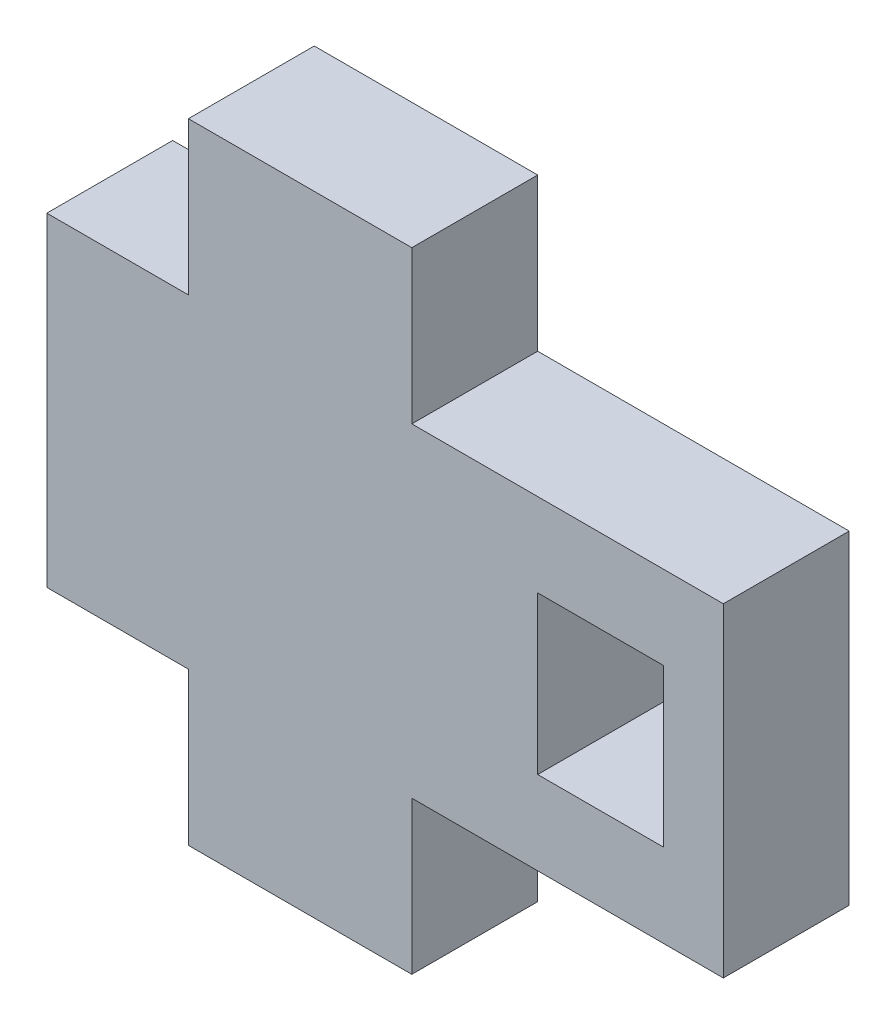
ISO-10303-21;
HEADER;
FILE_DESCRIPTION(('STEP AP214'),'2;1');
FILE_NAME('part.step','',(''),(''),'','','');
FILE_SCHEMA(('AUTOMOTIVE_DESIGN { 1 0 10303 214 1 1 1 1 }'));
ENDSEC;
DATA;
#1=APPLICATION_CONTEXT('core data for automotive mechanical design processes');
#2=APPLICATION_PROTOCOL_DEFINITION('international standard','automotive_design',2000,#1);
#3=PRODUCT_CONTEXT('',#1,'mechanical');
#4=PRODUCT('Part','Part','',(#3));
#5=PRODUCT_RELATED_PRODUCT_CATEGORY('part','',(#4));
#6=PRODUCT_DEFINITION_FORMATION('','',#4);
#7=PRODUCT_DEFINITION_CONTEXT('part definition',#1,'design');
#8=PRODUCT_DEFINITION('design','',#6,#7);
#9=PRODUCT_DEFINITION_SHAPE('','',#8);
#10=(LENGTH_UNIT() NAMED_UNIT(*) SI_UNIT(.MILLI.,.METRE.));
#11=(NAMED_UNIT(*) PLANE_ANGLE_UNIT() SI_UNIT($,.RADIAN.));
#12=(NAMED_UNIT(*) SI_UNIT($,.STERADIAN.) SOLID_ANGLE_UNIT());
#13=UNCERTAINTY_MEASURE_WITH_UNIT(LENGTH_MEASURE(1.E-05),#10,'distance_accuracy_value','');
#14=(GEOMETRIC_REPRESENTATION_CONTEXT(3) GLOBAL_UNCERTAINTY_ASSIGNED_CONTEXT((#13)) GLOBAL_UNIT_ASSIGNED_CONTEXT((#10,
#11,#12)) REPRESENTATION_CONTEXT('',''));
#15=CARTESIAN_POINT('',(0.,0.,0.));
#16=DIRECTION('',(0.,0.,1.));
#17=DIRECTION('',(1.,0.,0.));
#18=AXIS2_PLACEMENT_3D('',#15,#16,#17);
#19=CARTESIAN_POINT('',(0.,0.,2.));
#20=DIRECTION('',(0.,0.,1.));
#21=DIRECTION('',(1.,0.,0.));
#22=AXIS2_PLACEMENT_3D('',#19,#20,#21);
#23=PLANE('',#22);
#24=DIRECTION('',(0.,-1.,0.));
#25=VECTOR('',#24,1.);
#26=CARTESIAN_POINT('',(0.,0.,2.));
#27=LINE('',#26,#25);
#28=CARTESIAN_POINT('',(0.,4.85,2.));
#29=VERTEX_POINT('',#28);
#30=CARTESIAN_POINT('',(0.,0.,2.));
#31=VERTEX_POINT('',#30);
#32=EDGE_CURVE('E182',#29,#31,#27,.T.);
#33=ORIENTED_EDGE('',*,*,#32,.T.);
#34=DIRECTION('',(1.,0.,0.));
#35=VECTOR('',#34,1.);
#36=CARTESIAN_POINT('',(0.,0.,2.));
#37=LINE('',#36,#35);
#38=CARTESIAN_POINT('',(7.1,0.,2.));
#39=VERTEX_POINT('',#38);
#40=EDGE_CURVE('E185',#31,#39,#37,.T.);
#41=ORIENTED_EDGE('',*,*,#40,.T.);
#42=DIRECTION('',(0.,1.,0.));
#43=VECTOR('',#42,1.);
#44=CARTESIAN_POINT('',(7.1,0.,2.));
#45=LINE('',#44,#43);
#46=CARTESIAN_POINT('',(7.1,4.85,2.));
#47=VERTEX_POINT('',#46);
#48=EDGE_CURVE('E188',#39,#47,#45,.T.);
#49=ORIENTED_EDGE('',*,*,#48,.T.);
#50=DIRECTION('',(1.,0.,0.));
#51=VECTOR('',#50,1.);
#52=CARTESIAN_POINT('',(7.1,4.85,2.));
#53=LINE('',#52,#51);
#54=CARTESIAN_POINT('',(17.,4.85,2.));
#55=VERTEX_POINT('',#54);
#56=EDGE_CURVE('E190',#47,#55,#53,.T.);
#57=ORIENTED_EDGE('',*,*,#56,.T.);
#58=DIRECTION('',(0.,1.,0.));
#59=VECTOR('',#58,1.);
#60=CARTESIAN_POINT('',(17.,15.15,2.));
#61=LINE('',#60,#59);
#62=CARTESIAN_POINT('',(17.,15.15,2.));
#63=VERTEX_POINT('',#62);
#64=EDGE_CURVE('E192',#55,#63,#61,.T.);
#65=ORIENTED_EDGE('',*,*,#64,.T.);
#66=DIRECTION('',(-1.,0.,0.));
#67=VECTOR('',#66,1.);
#68=CARTESIAN_POINT('',(12.1,15.15,2.));
#69=LINE('',#68,#67);
#70=CARTESIAN_POINT('',(7.1,15.15,2.));
#71=VERTEX_POINT('',#70);
#72=EDGE_CURVE('E194',#63,#71,#69,.T.);
#73=ORIENTED_EDGE('',*,*,#72,.T.);
#74=DIRECTION('',(0.,1.,0.));
#75=VECTOR('',#74,1.);
#76=CARTESIAN_POINT('',(7.1,15.15,2.));
#77=LINE('',#76,#75);
#78=CARTESIAN_POINT('',(7.1,20.,2.));
#79=VERTEX_POINT('',#78);
#80=EDGE_CURVE('E196',#71,#79,#77,.T.);
#81=ORIENTED_EDGE('',*,*,#80,.T.);
#82=DIRECTION('',(-1.,0.,0.));
#83=VECTOR('',#82,1.);
#84=CARTESIAN_POINT('',(0.,20.,2.));
#85=LINE('',#84,#83);
#86=CARTESIAN_POINT('',(0.,20.,2.));
#87=VERTEX_POINT('',#86);
#88=EDGE_CURVE('E198',#79,#87,#85,.T.);
#89=ORIENTED_EDGE('',*,*,#88,.T.);
#90=DIRECTION('',(0.,-1.,0.));
#91=VECTOR('',#90,1.);
#92=CARTESIAN_POINT('',(0.,15.15,2.));
#93=LINE('',#92,#91);
#94=CARTESIAN_POINT('',(0.,15.15,2.));
#95=VERTEX_POINT('',#94);
#96=EDGE_CURVE('E200',#87,#95,#93,.T.);
#97=ORIENTED_EDGE('',*,*,#96,.T.);
#98=DIRECTION('',(-1.,0.,0.));
#99=VECTOR('',#98,1.);
#100=CARTESIAN_POINT('',(0.,15.15,2.));
#101=LINE('',#100,#99);
#102=CARTESIAN_POINT('',(-4.5,15.15,2.));
#103=VERTEX_POINT('',#102);
#104=EDGE_CURVE('E202',#95,#103,#101,.T.);
#105=ORIENTED_EDGE('',*,*,#104,.T.);
#106=DIRECTION('',(0.,-1.,0.));
#107=VECTOR('',#106,1.);
#108=CARTESIAN_POINT('',(-4.5,15.15,2.));
#109=LINE('',#108,#107);
#110=CARTESIAN_POINT('',(-4.5,4.85,2.));
#111=VERTEX_POINT('',#110);
#112=EDGE_CURVE('E204',#103,#111,#109,.T.);
#113=ORIENTED_EDGE('',*,*,#112,.T.);
#114=DIRECTION('',(1.,0.,0.));
#115=VECTOR('',#114,1.);
#116=CARTESIAN_POINT('',(0.,4.85,2.));
#117=LINE('',#116,#115);
#118=EDGE_CURVE('E206',#111,#29,#117,.T.);
#119=ORIENTED_EDGE('',*,*,#118,.T.);
#120=EDGE_LOOP('',(#33,#41,#49,#57,#65,#73,#81,#89,#97,#105,#113,#119));
#121=FACE_BOUND('',#120,.T.);
#122=DIRECTION('',(-1.,0.,0.));
#123=VECTOR('',#122,1.);
#124=CARTESIAN_POINT('',(15.1,12.5,2.));
#125=LINE('',#124,#123);
#126=CARTESIAN_POINT('',(15.1,12.5,2.));
#127=VERTEX_POINT('',#126);
#128=CARTESIAN_POINT('',(11.1,12.5,2.));
#129=VERTEX_POINT('',#128);
#130=EDGE_CURVE('E154',#127,#129,#125,.T.);
#131=ORIENTED_EDGE('',*,*,#130,.F.);
#132=DIRECTION('',(0.,1.,0.));
#133=VECTOR('',#132,1.);
#134=CARTESIAN_POINT('',(15.1,12.5,2.));
#135=LINE('',#134,#133);
#136=CARTESIAN_POINT('',(15.1,7.5,2.));
#137=VERTEX_POINT('',#136);
#138=EDGE_CURVE('E146',#137,#127,#135,.T.);
#139=ORIENTED_EDGE('',*,*,#138,.F.);
#140=DIRECTION('',(1.,0.,0.));
#141=VECTOR('',#140,1.);
#142=CARTESIAN_POINT('',(15.1,7.5,2.));
#143=LINE('',#142,#141);
#144=CARTESIAN_POINT('',(11.1,7.5,2.));
#145=VERTEX_POINT('',#144);
#146=EDGE_CURVE('E168',#145,#137,#143,.T.);
#147=ORIENTED_EDGE('',*,*,#146,.F.);
#148=DIRECTION('',(0.,-1.,0.));
#149=VECTOR('',#148,1.);
#150=CARTESIAN_POINT('',(11.1,12.5,2.));
#151=LINE('',#150,#149);
#152=EDGE_CURVE('E166',#129,#145,#151,.T.);
#153=ORIENTED_EDGE('',*,*,#152,.F.);
#154=EDGE_LOOP('',(#131,#139,#147,#153));
#155=FACE_BOUND('',#154,.T.);
#156=ADVANCED_FACE('F33',(#121,#155),#23,.T.);
#157=CARTESIAN_POINT('',(0.,0.,-2.));
#158=DIRECTION('',(0.,0.,1.));
#159=DIRECTION('',(1.,0.,0.));
#160=AXIS2_PLACEMENT_3D('',#157,#158,#159);
#161=PLANE('',#160);
#162=DIRECTION('',(0.,-1.,0.));
#163=VECTOR('',#162,1.);
#164=CARTESIAN_POINT('',(0.,0.,-2.));
#165=LINE('',#164,#163);
#166=CARTESIAN_POINT('',(0.,4.85,-2.));
#167=VERTEX_POINT('',#166);
#168=CARTESIAN_POINT('',(0.,0.,-2.));
#169=VERTEX_POINT('',#168);
#170=EDGE_CURVE('E162',#167,#169,#165,.T.);
#171=ORIENTED_EDGE('',*,*,#170,.F.);
#172=DIRECTION('',(1.,0.,0.));
#173=VECTOR('',#172,1.);
#174=CARTESIAN_POINT('',(0.,4.85,-2.));
#175=LINE('',#174,#173);
#176=CARTESIAN_POINT('',(-4.5,4.85,-2.));
#177=VERTEX_POINT('',#176);
#178=EDGE_CURVE('E186',#177,#167,#175,.T.);
#179=ORIENTED_EDGE('',*,*,#178,.F.);
#180=DIRECTION('',(0.,-1.,0.));
#181=VECTOR('',#180,1.);
#182=CARTESIAN_POINT('',(-4.5,15.15,-2.));
#183=LINE('',#182,#181);
#184=CARTESIAN_POINT('',(-4.5,15.15,-2.));
#185=VERTEX_POINT('',#184);
#186=EDGE_CURVE('E231',#185,#177,#183,.T.);
#187=ORIENTED_EDGE('',*,*,#186,.F.);
#188=DIRECTION('',(-1.,0.,0.));
#189=VECTOR('',#188,1.);
#190=CARTESIAN_POINT('',(0.,15.15,-2.));
#191=LINE('',#190,#189);
#192=CARTESIAN_POINT('',(0.,15.15,-2.));
#193=VERTEX_POINT('',#192);
#194=EDGE_CURVE('E229',#193,#185,#191,.T.);
#195=ORIENTED_EDGE('',*,*,#194,.F.);
#196=DIRECTION('',(0.,-1.,0.));
#197=VECTOR('',#196,1.);
#198=CARTESIAN_POINT('',(0.,15.15,-2.));
#199=LINE('',#198,#197);
#200=CARTESIAN_POINT('',(0.,20.,-2.));
#201=VERTEX_POINT('',#200);
#202=EDGE_CURVE('E227',#201,#193,#199,.T.);
#203=ORIENTED_EDGE('',*,*,#202,.F.);
#204=DIRECTION('',(-1.,0.,0.));
#205=VECTOR('',#204,1.);
#206=CARTESIAN_POINT('',(0.,20.,-2.));
#207=LINE('',#206,#205);
#208=CARTESIAN_POINT('',(7.1,20.,-2.));
#209=VERTEX_POINT('',#208);
#210=EDGE_CURVE('E225',#209,#201,#207,.T.);
#211=ORIENTED_EDGE('',*,*,#210,.F.);
#212=DIRECTION('',(0.,1.,0.));
#213=VECTOR('',#212,1.);
#214=CARTESIAN_POINT('',(7.1,15.15,-2.));
#215=LINE('',#214,#213);
#216=CARTESIAN_POINT('',(7.1,15.15,-2.));
#217=VERTEX_POINT('',#216);
#218=EDGE_CURVE('E223',#217,#209,#215,.T.);
#219=ORIENTED_EDGE('',*,*,#218,.F.);
#220=DIRECTION('',(-1.,0.,0.));
#221=VECTOR('',#220,1.);
#222=CARTESIAN_POINT('',(7.1,15.15,-2.));
#223=LINE('',#222,#221);
#224=CARTESIAN_POINT('',(17.,15.15,-2.));
#225=VERTEX_POINT('',#224);
#226=EDGE_CURVE('E221',#225,#217,#223,.T.);
#227=ORIENTED_EDGE('',*,*,#226,.F.);
#228=DIRECTION('',(0.,1.,0.));
#229=VECTOR('',#228,1.);
#230=CARTESIAN_POINT('',(17.,15.15,-2.));
#231=LINE('',#230,#229);
#232=CARTESIAN_POINT('',(17.,4.85,-2.));
#233=VERTEX_POINT('',#232);
#234=EDGE_CURVE('E218',#233,#225,#231,.T.);
#235=ORIENTED_EDGE('',*,*,#234,.F.);
#236=DIRECTION('',(1.,0.,0.));
#237=VECTOR('',#236,1.);
#238=CARTESIAN_POINT('',(12.1,4.85,-2.));
#239=LINE('',#238,#237);
#240=CARTESIAN_POINT('',(7.1,4.85,-2.));
#241=VERTEX_POINT('',#240);
#242=EDGE_CURVE('E216',#241,#233,#239,.T.);
#243=ORIENTED_EDGE('',*,*,#242,.F.);
#244=DIRECTION('',(0.,1.,0.));
#245=VECTOR('',#244,1.);
#246=CARTESIAN_POINT('',(7.1,0.,-2.));
#247=LINE('',#246,#245);
#248=CARTESIAN_POINT('',(7.1,0.,-2.));
#249=VERTEX_POINT('',#248);
#250=EDGE_CURVE('E213',#249,#241,#247,.T.);
#251=ORIENTED_EDGE('',*,*,#250,.F.);
#252=DIRECTION('',(1.,0.,0.));
#253=VECTOR('',#252,1.);
#254=CARTESIAN_POINT('',(0.,0.,-2.));
#255=LINE('',#254,#253);
#256=EDGE_CURVE('E211',#169,#249,#255,.T.);
#257=ORIENTED_EDGE('',*,*,#256,.F.);
#258=EDGE_LOOP('',(#171,#179,#187,#195,#203,#211,#219,#227,#235,#243,#251,#257));
#259=FACE_BOUND('',#258,.T.);
#260=DIRECTION('',(0.,1.,0.));
#261=VECTOR('',#260,1.);
#262=CARTESIAN_POINT('',(15.1,12.5,-2.));
#263=LINE('',#262,#261);
#264=CARTESIAN_POINT('',(15.1,7.5,-2.));
#265=VERTEX_POINT('',#264);
#266=CARTESIAN_POINT('',(15.1,12.5,-2.));
#267=VERTEX_POINT('',#266);
#268=EDGE_CURVE('E56',#265,#267,#263,.T.);
#269=ORIENTED_EDGE('',*,*,#268,.T.);
#270=DIRECTION('',(-1.,0.,0.));
#271=VECTOR('',#270,1.);
#272=CARTESIAN_POINT('',(15.1,12.5,-2.));
#273=LINE('',#272,#271);
#274=CARTESIAN_POINT('',(11.1,12.5,-2.));
#275=VERTEX_POINT('',#274);
#276=EDGE_CURVE('E161',#267,#275,#273,.T.);
#277=ORIENTED_EDGE('',*,*,#276,.T.);
#278=DIRECTION('',(0.,-1.,0.));
#279=VECTOR('',#278,1.);
#280=CARTESIAN_POINT('',(11.1,12.5,-2.));
#281=LINE('',#280,#279);
#282=CARTESIAN_POINT('',(11.1,7.5,-2.));
#283=VERTEX_POINT('',#282);
#284=EDGE_CURVE('E174',#275,#283,#281,.T.);
#285=ORIENTED_EDGE('',*,*,#284,.T.);
#286=DIRECTION('',(1.,0.,0.));
#287=VECTOR('',#286,1.);
#288=CARTESIAN_POINT('',(15.1,7.5,-2.));
#289=LINE('',#288,#287);
#290=EDGE_CURVE('E155',#283,#265,#289,.T.);
#291=ORIENTED_EDGE('',*,*,#290,.T.);
#292=EDGE_LOOP('',(#269,#277,#285,#291));
#293=FACE_BOUND('',#292,.T.);
#294=ADVANCED_FACE('F272',(#259,#293),#161,.F.);
#295=CARTESIAN_POINT('',(0.,0.,2.));
#296=DIRECTION('',(1.,0.,0.));
#297=DIRECTION('',(0.,0.,-1.));
#298=AXIS2_PLACEMENT_3D('',#295,#296,#297);
#299=PLANE('',#298);
#300=ORIENTED_EDGE('',*,*,#170,.T.);
#301=DIRECTION('',(0.,0.,-1.));
#302=VECTOR('',#301,1.);
#303=CARTESIAN_POINT('',(0.,0.,2.));
#304=LINE('',#303,#302);
#305=EDGE_CURVE('E11',#31,#169,#304,.T.);
#306=ORIENTED_EDGE('',*,*,#305,.F.);
#307=ORIENTED_EDGE('',*,*,#32,.F.);
#308=DIRECTION('',(0.,0.,-1.));
#309=VECTOR('',#308,1.);
#310=CARTESIAN_POINT('',(0.,4.85,2.));
#311=LINE('',#310,#309);
#312=EDGE_CURVE('E208',#29,#167,#311,.T.);
#313=ORIENTED_EDGE('',*,*,#312,.T.);
#314=EDGE_LOOP('',(#300,#306,#307,#313));
#315=FACE_BOUND('',#314,.T.);
#316=ADVANCED_FACE('F35',(#315),#299,.F.);
#317=CARTESIAN_POINT('',(0.,0.,2.));
#318=DIRECTION('',(0.,1.,0.));
#319=DIRECTION('',(0.,0.,1.));
#320=AXIS2_PLACEMENT_3D('',#317,#318,#319);
#321=PLANE('',#320);
#322=ORIENTED_EDGE('',*,*,#256,.T.);
#323=DIRECTION('',(0.,0.,-1.));
#324=VECTOR('',#323,1.);
#325=CARTESIAN_POINT('',(7.1,0.,2.));
#326=LINE('',#325,#324);
#327=EDGE_CURVE('E41',#39,#249,#326,.T.);
#328=ORIENTED_EDGE('',*,*,#327,.F.);
#329=ORIENTED_EDGE('',*,*,#40,.F.);
#330=ORIENTED_EDGE('',*,*,#305,.T.);
#331=EDGE_LOOP('',(#322,#328,#329,#330));
#332=FACE_BOUND('',#331,.T.);
#333=ADVANCED_FACE('F288',(#332),#321,.F.);
#334=CARTESIAN_POINT('',(7.1,0.,2.));
#335=DIRECTION('',(-1.,0.,0.));
#336=DIRECTION('',(0.,0.,1.));
#337=AXIS2_PLACEMENT_3D('',#334,#335,#336);
#338=PLANE('',#337);
#339=ORIENTED_EDGE('',*,*,#250,.T.);
#340=DIRECTION('',(0.,0.,-1.));
#341=VECTOR('',#340,1.);
#342=CARTESIAN_POINT('',(7.1,4.85,2.));
#343=LINE('',#342,#341);
#344=EDGE_CURVE('E260',#47,#241,#343,.T.);
#345=ORIENTED_EDGE('',*,*,#344,.F.);
#346=ORIENTED_EDGE('',*,*,#48,.F.);
#347=ORIENTED_EDGE('',*,*,#327,.T.);
#348=EDGE_LOOP('',(#339,#345,#346,#347));
#349=FACE_BOUND('',#348,.T.);
#350=ADVANCED_FACE('F267',(#349),#338,.F.);
#351=CARTESIAN_POINT('',(12.1,4.85,2.));
#352=DIRECTION('',(0.,1.,0.));
#353=DIRECTION('',(0.,0.,1.));
#354=AXIS2_PLACEMENT_3D('',#351,#352,#353);
#355=PLANE('',#354);
#356=ORIENTED_EDGE('',*,*,#242,.T.);
#357=DIRECTION('',(0.,0.,-1.));
#358=VECTOR('',#357,1.);
#359=CARTESIAN_POINT('',(17.,4.85,2.));
#360=LINE('',#359,#358);
#361=EDGE_CURVE('E257',#55,#233,#360,.T.);
#362=ORIENTED_EDGE('',*,*,#361,.F.);
#363=ORIENTED_EDGE('',*,*,#56,.F.);
#364=ORIENTED_EDGE('',*,*,#344,.T.);
#365=EDGE_LOOP('',(#356,#362,#363,#364));
#366=FACE_BOUND('',#365,.T.);
#367=ADVANCED_FACE('F277',(#366),#355,.F.);
#368=CARTESIAN_POINT('',(17.,15.15,2.));
#369=DIRECTION('',(-1.,0.,0.));
#370=DIRECTION('',(0.,0.,1.));
#371=AXIS2_PLACEMENT_3D('',#368,#369,#370);
#372=PLANE('',#371);
#373=ORIENTED_EDGE('',*,*,#234,.T.);
#374=DIRECTION('',(0.,0.,-1.));
#375=VECTOR('',#374,1.);
#376=CARTESIAN_POINT('',(17.,15.15,2.));
#377=LINE('',#376,#375);
#378=EDGE_CURVE('E254',#63,#225,#377,.T.);
#379=ORIENTED_EDGE('',*,*,#378,.F.);
#380=ORIENTED_EDGE('',*,*,#64,.F.);
#381=ORIENTED_EDGE('',*,*,#361,.T.);
#382=EDGE_LOOP('',(#373,#379,#380,#381));
#383=FACE_BOUND('',#382,.T.);
#384=ADVANCED_FACE('F281',(#383),#372,.F.);
#385=CARTESIAN_POINT('',(7.1,15.15,2.));
#386=DIRECTION('',(0.,-1.,0.));
#387=DIRECTION('',(0.,0.,-1.));
#388=AXIS2_PLACEMENT_3D('',#385,#386,#387);
#389=PLANE('',#388);
#390=ORIENTED_EDGE('',*,*,#226,.T.);
#391=DIRECTION('',(0.,0.,-1.));
#392=VECTOR('',#391,1.);
#393=CARTESIAN_POINT('',(7.1,15.15,2.));
#394=LINE('',#393,#392);
#395=EDGE_CURVE('E251',#71,#217,#394,.T.);
#396=ORIENTED_EDGE('',*,*,#395,.F.);
#397=ORIENTED_EDGE('',*,*,#72,.F.);
#398=ORIENTED_EDGE('',*,*,#378,.T.);
#399=EDGE_LOOP('',(#390,#396,#397,#398));
#400=FACE_BOUND('',#399,.T.);
#401=ADVANCED_FACE('F321',(#400),#389,.F.);
#402=CARTESIAN_POINT('',(7.1,15.15,2.));
#403=DIRECTION('',(-1.,0.,0.));
#404=DIRECTION('',(0.,0.,1.));
#405=AXIS2_PLACEMENT_3D('',#402,#403,#404);
#406=PLANE('',#405);
#407=ORIENTED_EDGE('',*,*,#218,.T.);
#408=DIRECTION('',(0.,0.,-1.));
#409=VECTOR('',#408,1.);
#410=CARTESIAN_POINT('',(7.1,20.,2.));
#411=LINE('',#410,#409);
#412=EDGE_CURVE('E248',#79,#209,#411,.T.);
#413=ORIENTED_EDGE('',*,*,#412,.F.);
#414=ORIENTED_EDGE('',*,*,#80,.F.);
#415=ORIENTED_EDGE('',*,*,#395,.T.);
#416=EDGE_LOOP('',(#407,#413,#414,#415));
#417=FACE_BOUND('',#416,.T.);
#418=ADVANCED_FACE('F319',(#417),#406,.F.);
#419=CARTESIAN_POINT('',(0.,20.,2.));
#420=DIRECTION('',(0.,-1.,0.));
#421=DIRECTION('',(0.,0.,-1.));
#422=AXIS2_PLACEMENT_3D('',#419,#420,#421);
#423=PLANE('',#422);
#424=ORIENTED_EDGE('',*,*,#210,.T.);
#425=DIRECTION('',(0.,0.,-1.));
#426=VECTOR('',#425,1.);
#427=CARTESIAN_POINT('',(0.,20.,2.));
#428=LINE('',#427,#426);
#429=EDGE_CURVE('E245',#87,#201,#428,.T.);
#430=ORIENTED_EDGE('',*,*,#429,.F.);
#431=ORIENTED_EDGE('',*,*,#88,.F.);
#432=ORIENTED_EDGE('',*,*,#412,.T.);
#433=EDGE_LOOP('',(#424,#430,#431,#432));
#434=FACE_BOUND('',#433,.T.);
#435=ADVANCED_FACE('F315',(#434),#423,.F.);
#436=CARTESIAN_POINT('',(0.,15.15,2.));
#437=DIRECTION('',(1.,0.,0.));
#438=DIRECTION('',(0.,0.,-1.));
#439=AXIS2_PLACEMENT_3D('',#436,#437,#438);
#440=PLANE('',#439);
#441=ORIENTED_EDGE('',*,*,#202,.T.);
#442=DIRECTION('',(0.,0.,-1.));
#443=VECTOR('',#442,1.);
#444=CARTESIAN_POINT('',(0.,15.15,2.));
#445=LINE('',#444,#443);
#446=EDGE_CURVE('E242',#95,#193,#445,.T.);
#447=ORIENTED_EDGE('',*,*,#446,.F.);
#448=ORIENTED_EDGE('',*,*,#96,.F.);
#449=ORIENTED_EDGE('',*,*,#429,.T.);
#450=EDGE_LOOP('',(#441,#447,#448,#449));
#451=FACE_BOUND('',#450,.T.);
#452=ADVANCED_FACE('F310',(#451),#440,.F.);
#453=CARTESIAN_POINT('',(0.,15.15,2.));
#454=DIRECTION('',(0.,-1.,0.));
#455=DIRECTION('',(0.,0.,-1.));
#456=AXIS2_PLACEMENT_3D('',#453,#454,#455);
#457=PLANE('',#456);
#458=ORIENTED_EDGE('',*,*,#194,.T.);
#459=DIRECTION('',(0.,0.,-1.));
#460=VECTOR('',#459,1.);
#461=CARTESIAN_POINT('',(-4.5,15.15,2.));
#462=LINE('',#461,#460);
#463=EDGE_CURVE('E239',#103,#185,#462,.T.);
#464=ORIENTED_EDGE('',*,*,#463,.F.);
#465=ORIENTED_EDGE('',*,*,#104,.F.);
#466=ORIENTED_EDGE('',*,*,#446,.T.);
#467=EDGE_LOOP('',(#458,#464,#465,#466));
#468=FACE_BOUND('',#467,.T.);
#469=ADVANCED_FACE('F304',(#468),#457,.F.);
#470=CARTESIAN_POINT('',(-4.5,15.15,2.));
#471=DIRECTION('',(1.,0.,0.));
#472=DIRECTION('',(0.,0.,-1.));
#473=AXIS2_PLACEMENT_3D('',#470,#471,#472);
#474=PLANE('',#473);
#475=ORIENTED_EDGE('',*,*,#186,.T.);
#476=DIRECTION('',(0.,0.,-1.));
#477=VECTOR('',#476,1.);
#478=CARTESIAN_POINT('',(-4.5,4.85,2.));
#479=LINE('',#478,#477);
#480=EDGE_CURVE('E236',#111,#177,#479,.T.);
#481=ORIENTED_EDGE('',*,*,#480,.F.);
#482=ORIENTED_EDGE('',*,*,#112,.F.);
#483=ORIENTED_EDGE('',*,*,#463,.T.);
#484=EDGE_LOOP('',(#475,#481,#482,#483));
#485=FACE_BOUND('',#484,.T.);
#486=ADVANCED_FACE('F300',(#485),#474,.F.);
#487=CARTESIAN_POINT('',(0.,4.85,2.));
#488=DIRECTION('',(0.,1.,0.));
#489=DIRECTION('',(-1.,0.,0.));
#490=AXIS2_PLACEMENT_3D('',#487,#488,#489);
#491=PLANE('',#490);
#492=ORIENTED_EDGE('',*,*,#178,.T.);
#493=ORIENTED_EDGE('',*,*,#312,.F.);
#494=ORIENTED_EDGE('',*,*,#118,.F.);
#495=ORIENTED_EDGE('',*,*,#480,.T.);
#496=EDGE_LOOP('',(#492,#493,#494,#495));
#497=FACE_BOUND('',#496,.T.);
#498=ADVANCED_FACE('F295',(#497),#491,.F.);
#499=CARTESIAN_POINT('',(15.1,12.5,2.));
#500=DIRECTION('',(-1.,0.,0.));
#501=DIRECTION('',(0.,-1.,0.));
#502=AXIS2_PLACEMENT_3D('',#499,#500,#501);
#503=PLANE('',#502);
#504=ORIENTED_EDGE('',*,*,#268,.F.);
#505=DIRECTION('',(0.,0.,-1.));
#506=VECTOR('',#505,1.);
#507=CARTESIAN_POINT('',(15.1,7.5,2.));
#508=LINE('',#507,#506);
#509=EDGE_CURVE('E150',#137,#265,#508,.T.);
#510=ORIENTED_EDGE('',*,*,#509,.F.);
#511=ORIENTED_EDGE('',*,*,#138,.T.);
#512=DIRECTION('',(0.,0.,-1.));
#513=VECTOR('',#512,1.);
#514=CARTESIAN_POINT('',(15.1,12.5,2.));
#515=LINE('',#514,#513);
#516=EDGE_CURVE('E149',#127,#267,#515,.T.);
#517=ORIENTED_EDGE('',*,*,#516,.T.);
#518=EDGE_LOOP('',(#504,#510,#511,#517));
#519=FACE_BOUND('',#518,.T.);
#520=ADVANCED_FACE('F148',(#519),#503,.T.);
#521=CARTESIAN_POINT('',(15.1,12.5,2.));
#522=DIRECTION('',(0.,-1.,0.));
#523=DIRECTION('',(0.,0.,-1.));
#524=AXIS2_PLACEMENT_3D('',#521,#522,#523);
#525=PLANE('',#524);
#526=ORIENTED_EDGE('',*,*,#276,.F.);
#527=ORIENTED_EDGE('',*,*,#516,.F.);
#528=ORIENTED_EDGE('',*,*,#130,.T.);
#529=DIRECTION('',(0.,0.,-1.));
#530=VECTOR('',#529,1.);
#531=CARTESIAN_POINT('',(11.1,12.5,2.));
#532=LINE('',#531,#530);
#533=EDGE_CURVE('E163',#129,#275,#532,.T.);
#534=ORIENTED_EDGE('',*,*,#533,.T.);
#535=EDGE_LOOP('',(#526,#527,#528,#534));
#536=FACE_BOUND('',#535,.T.);
#537=ADVANCED_FACE('F158',(#536),#525,.T.);
#538=CARTESIAN_POINT('',(11.1,12.5,2.));
#539=DIRECTION('',(1.,0.,0.));
#540=DIRECTION('',(0.,1.,0.));
#541=AXIS2_PLACEMENT_3D('',#538,#539,#540);
#542=PLANE('',#541);
#543=ORIENTED_EDGE('',*,*,#284,.F.);
#544=ORIENTED_EDGE('',*,*,#533,.F.);
#545=ORIENTED_EDGE('',*,*,#152,.T.);
#546=DIRECTION('',(0.,0.,-1.));
#547=VECTOR('',#546,1.);
#548=CARTESIAN_POINT('',(11.1,7.5,2.));
#549=LINE('',#548,#547);
#550=EDGE_CURVE('E48',#145,#283,#549,.T.);
#551=ORIENTED_EDGE('',*,*,#550,.T.);
#552=EDGE_LOOP('',(#543,#544,#545,#551));
#553=FACE_BOUND('',#552,.T.);
#554=ADVANCED_FACE('F379',(#553),#542,.T.);
#555=CARTESIAN_POINT('',(15.1,7.5,2.));
#556=DIRECTION('',(0.,1.,0.));
#557=DIRECTION('',(0.,0.,1.));
#558=AXIS2_PLACEMENT_3D('',#555,#556,#557);
#559=PLANE('',#558);
#560=ORIENTED_EDGE('',*,*,#290,.F.);
#561=ORIENTED_EDGE('',*,*,#550,.F.);
#562=ORIENTED_EDGE('',*,*,#146,.T.);
#563=ORIENTED_EDGE('',*,*,#509,.T.);
#564=EDGE_LOOP('',(#560,#561,#562,#563));
#565=FACE_BOUND('',#564,.T.);
#566=ADVANCED_FACE('F385',(#565),#559,.T.);
#567=CLOSED_SHELL('',(#156,#294,#316,#333,#350,#367,#384,#401,#418,#435,#452,#469,#486,#498,
#520,#537,#554,#566));
#568=MANIFOLD_SOLID_BREP('B2',#567);
#569=ADVANCED_BREP_SHAPE_REPRESENTATION('',(#18,#568),#14);
#570=SHAPE_DEFINITION_REPRESENTATION(#9,#569);
ENDSEC;
END-ISO-10303-21;
